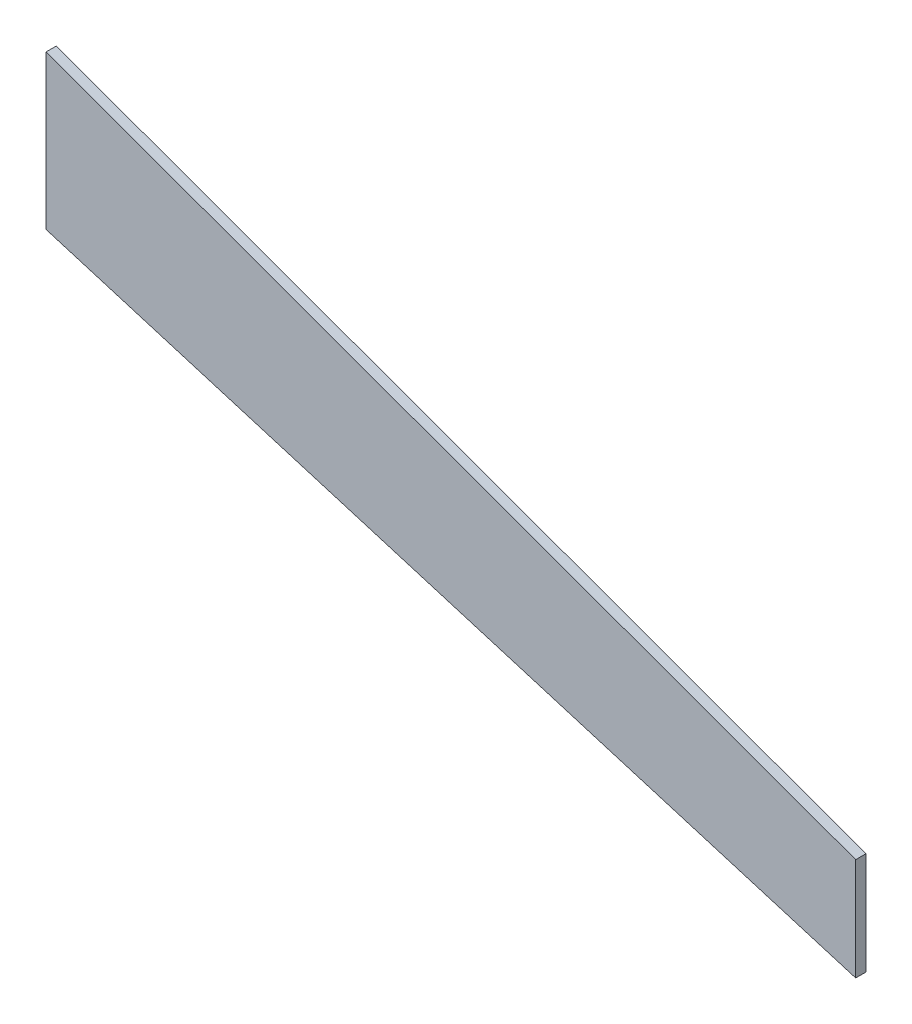
ISO-10303-21;
HEADER;
FILE_DESCRIPTION(('STEP AP214'),'2;1');
FILE_NAME('part.step','',(''),(''),'','','');
FILE_SCHEMA(('AUTOMOTIVE_DESIGN { 1 0 10303 214 1 1 1 1 }'));
ENDSEC;
DATA;
#1=APPLICATION_CONTEXT('core data for automotive mechanical design processes');
#2=APPLICATION_PROTOCOL_DEFINITION('international standard','automotive_design',2000,#1);
#3=PRODUCT_CONTEXT('',#1,'mechanical');
#4=PRODUCT('Part','Part','',(#3));
#5=PRODUCT_RELATED_PRODUCT_CATEGORY('part','',(#4));
#6=PRODUCT_DEFINITION_FORMATION('','',#4);
#7=PRODUCT_DEFINITION_CONTEXT('part definition',#1,'design');
#8=PRODUCT_DEFINITION('design','',#6,#7);
#9=PRODUCT_DEFINITION_SHAPE('','',#8);
#10=(LENGTH_UNIT() NAMED_UNIT(*) SI_UNIT(.MILLI.,.METRE.));
#11=(NAMED_UNIT(*) PLANE_ANGLE_UNIT() SI_UNIT($,.RADIAN.));
#12=(NAMED_UNIT(*) SI_UNIT($,.STERADIAN.) SOLID_ANGLE_UNIT());
#13=UNCERTAINTY_MEASURE_WITH_UNIT(LENGTH_MEASURE(1.E-05),#10,'distance_accuracy_value','');
#14=(GEOMETRIC_REPRESENTATION_CONTEXT(3) GLOBAL_UNCERTAINTY_ASSIGNED_CONTEXT((#13)) GLOBAL_UNIT_ASSIGNED_CONTEXT((#10,
#11,#12)) REPRESENTATION_CONTEXT('',''));
#15=CARTESIAN_POINT('',(0.,0.,0.));
#16=DIRECTION('',(0.,0.,1.));
#17=DIRECTION('',(1.,0.,0.));
#18=AXIS2_PLACEMENT_3D('',#15,#16,#17);
#19=CARTESIAN_POINT('',(316.,-55.0145940281177,4.));
#20=DIRECTION('',(-0.342020143325663,-0.939692620785911,0.));
#21=DIRECTION('',(0.939692620785911,-0.342020143325663,0.));
#22=AXIS2_PLACEMENT_3D('',#19,#20,#21);
#23=PLANE('',#22);
#24=DIRECTION('',(-0.939692620785911,0.342020143325663,0.));
#25=VECTOR('',#24,1.);
#26=CARTESIAN_POINT('',(316.,-55.0145940281177,0.));
#27=LINE('',#26,#25);
#28=CARTESIAN_POINT('',(316.,-55.0145940281177,0.));
#29=VERTEX_POINT('',#28);
#30=CARTESIAN_POINT('',(0.,60.,0.));
#31=VERTEX_POINT('',#30);
#32=EDGE_CURVE('E96',#29,#31,#27,.T.);
#33=ORIENTED_EDGE('',*,*,#32,.T.);
#34=DIRECTION('',(0.,0.,-1.));
#35=VECTOR('',#34,1.);
#36=CARTESIAN_POINT('',(0.,60.,4.));
#37=LINE('',#36,#35);
#38=CARTESIAN_POINT('',(0.,60.,4.));
#39=VERTEX_POINT('',#38);
#40=EDGE_CURVE('E11',#39,#31,#37,.T.);
#41=ORIENTED_EDGE('',*,*,#40,.F.);
#42=DIRECTION('',(-0.939692620785911,0.342020143325663,0.));
#43=VECTOR('',#42,1.);
#44=CARTESIAN_POINT('',(316.,-55.0145940281177,4.));
#45=LINE('',#44,#43);
#46=CARTESIAN_POINT('',(316.,-55.0145940281177,4.));
#47=VERTEX_POINT('',#46);
#48=EDGE_CURVE('E84',#47,#39,#45,.T.);
#49=ORIENTED_EDGE('',*,*,#48,.F.);
#50=DIRECTION('',(0.,0.,-1.));
#51=VECTOR('',#50,1.);
#52=CARTESIAN_POINT('',(316.,-55.0145940281177,4.));
#53=LINE('',#52,#51);
#54=EDGE_CURVE('E92',#47,#29,#53,.T.);
#55=ORIENTED_EDGE('',*,*,#54,.T.);
#56=EDGE_LOOP('',(#33,#41,#49,#55));
#57=FACE_BOUND('',#56,.T.);
#58=ADVANCED_FACE('F33',(#57),#23,.F.);
#59=CARTESIAN_POINT('',(0.,60.,4.));
#60=DIRECTION('',(1.,0.,0.));
#61=DIRECTION('',(0.,1.,0.));
#62=AXIS2_PLACEMENT_3D('',#59,#60,#61);
#63=PLANE('',#62);
#64=DIRECTION('',(0.,-1.,0.));
#65=VECTOR('',#64,1.);
#66=CARTESIAN_POINT('',(0.,60.,0.));
#67=LINE('',#66,#65);
#68=CARTESIAN_POINT('',(0.,0.,0.));
#69=VERTEX_POINT('',#68);
#70=EDGE_CURVE('E88',#31,#69,#67,.T.);
#71=ORIENTED_EDGE('',*,*,#70,.T.);
#72=DIRECTION('',(0.,0.,-1.));
#73=VECTOR('',#72,1.);
#74=CARTESIAN_POINT('',(0.,0.,4.));
#75=LINE('',#74,#73);
#76=CARTESIAN_POINT('',(0.,0.,4.));
#77=VERTEX_POINT('',#76);
#78=EDGE_CURVE('E41',#77,#69,#75,.T.);
#79=ORIENTED_EDGE('',*,*,#78,.F.);
#80=DIRECTION('',(0.,-1.,0.));
#81=VECTOR('',#80,1.);
#82=CARTESIAN_POINT('',(0.,60.,4.));
#83=LINE('',#82,#81);
#84=EDGE_CURVE('E79',#39,#77,#83,.T.);
#85=ORIENTED_EDGE('',*,*,#84,.F.);
#86=ORIENTED_EDGE('',*,*,#40,.T.);
#87=EDGE_LOOP('',(#71,#79,#85,#86));
#88=FACE_BOUND('',#87,.T.);
#89=ADVANCED_FACE('F87',(#88),#63,.F.);
#90=CARTESIAN_POINT('',(316.,-95.0145940281177,4.));
#91=DIRECTION('',(0.287944465954652,0.957647108556221,0.));
#92=DIRECTION('',(-0.957647108556221,0.287944465954652,0.));
#93=AXIS2_PLACEMENT_3D('',#90,#91,#92);
#94=PLANE('',#93);
#95=DIRECTION('',(0.957647108556221,-0.287944465954652,0.));
#96=VECTOR('',#95,1.);
#97=CARTESIAN_POINT('',(316.,-95.0145940281177,0.));
#98=LINE('',#97,#96);
#99=CARTESIAN_POINT('',(316.,-95.0145940281177,0.));
#100=VERTEX_POINT('',#99);
#101=EDGE_CURVE('E66',#69,#100,#98,.T.);
#102=ORIENTED_EDGE('',*,*,#101,.T.);
#103=DIRECTION('',(0.,0.,-1.));
#104=VECTOR('',#103,1.);
#105=CARTESIAN_POINT('',(316.,-95.0145940281177,4.));
#106=LINE('',#105,#104);
#107=CARTESIAN_POINT('',(316.,-95.0145940281177,4.));
#108=VERTEX_POINT('',#107);
#109=EDGE_CURVE('E89',#108,#100,#106,.T.);
#110=ORIENTED_EDGE('',*,*,#109,.F.);
#111=DIRECTION('',(0.957647108556221,-0.287944465954652,0.));
#112=VECTOR('',#111,1.);
#113=CARTESIAN_POINT('',(316.,-95.0145940281177,4.));
#114=LINE('',#113,#112);
#115=EDGE_CURVE('E82',#77,#108,#114,.T.);
#116=ORIENTED_EDGE('',*,*,#115,.F.);
#117=ORIENTED_EDGE('',*,*,#78,.T.);
#118=EDGE_LOOP('',(#102,#110,#116,#117));
#119=FACE_BOUND('',#118,.T.);
#120=ADVANCED_FACE('F90',(#119),#94,.F.);
#121=CARTESIAN_POINT('',(316.,-55.0145940281177,4.));
#122=DIRECTION('',(-1.,0.,0.));
#123=DIRECTION('',(0.,0.,1.));
#124=AXIS2_PLACEMENT_3D('',#121,#122,#123);
#125=PLANE('',#124);
#126=DIRECTION('',(0.,1.,0.));
#127=VECTOR('',#126,1.);
#128=CARTESIAN_POINT('',(316.,-55.0145940281177,0.));
#129=LINE('',#128,#127);
#130=EDGE_CURVE('E72',#100,#29,#129,.T.);
#131=ORIENTED_EDGE('',*,*,#130,.T.);
#132=ORIENTED_EDGE('',*,*,#54,.F.);
#133=DIRECTION('',(0.,1.,0.));
#134=VECTOR('',#133,1.);
#135=CARTESIAN_POINT('',(316.,-55.0145940281177,4.));
#136=LINE('',#135,#134);
#137=EDGE_CURVE('E49',#108,#47,#136,.T.);
#138=ORIENTED_EDGE('',*,*,#137,.F.);
#139=ORIENTED_EDGE('',*,*,#109,.T.);
#140=EDGE_LOOP('',(#131,#132,#138,#139));
#141=FACE_BOUND('',#140,.T.);
#142=ADVANCED_FACE('F103',(#141),#125,.F.);
#143=CARTESIAN_POINT('',(0.,0.,4.));
#144=DIRECTION('',(0.,0.,1.));
#145=DIRECTION('',(1.,0.,0.));
#146=AXIS2_PLACEMENT_3D('',#143,#144,#145);
#147=PLANE('',#146);
#148=ORIENTED_EDGE('',*,*,#48,.T.);
#149=ORIENTED_EDGE('',*,*,#84,.T.);
#150=ORIENTED_EDGE('',*,*,#115,.T.);
#151=ORIENTED_EDGE('',*,*,#137,.T.);
#152=EDGE_LOOP('',(#148,#149,#150,#151));
#153=FACE_BOUND('',#152,.T.);
#154=ADVANCED_FACE('F80',(#153),#147,.T.);
#155=CARTESIAN_POINT('',(0.,0.,0.));
#156=DIRECTION('',(0.,0.,1.));
#157=DIRECTION('',(1.,0.,0.));
#158=AXIS2_PLACEMENT_3D('',#155,#156,#157);
#159=PLANE('',#158);
#160=ORIENTED_EDGE('',*,*,#32,.F.);
#161=ORIENTED_EDGE('',*,*,#130,.F.);
#162=ORIENTED_EDGE('',*,*,#101,.F.);
#163=ORIENTED_EDGE('',*,*,#70,.F.);
#164=EDGE_LOOP('',(#160,#161,#162,#163));
#165=FACE_BOUND('',#164,.T.);
#166=ADVANCED_FACE('F106',(#165),#159,.F.);
#167=CLOSED_SHELL('',(#58,#89,#120,#142,#154,#166));
#168=MANIFOLD_SOLID_BREP('B2',#167);
#169=ADVANCED_BREP_SHAPE_REPRESENTATION('',(#18,#168),#14);
#170=SHAPE_DEFINITION_REPRESENTATION(#9,#169);
ENDSEC;
END-ISO-10303-21;
